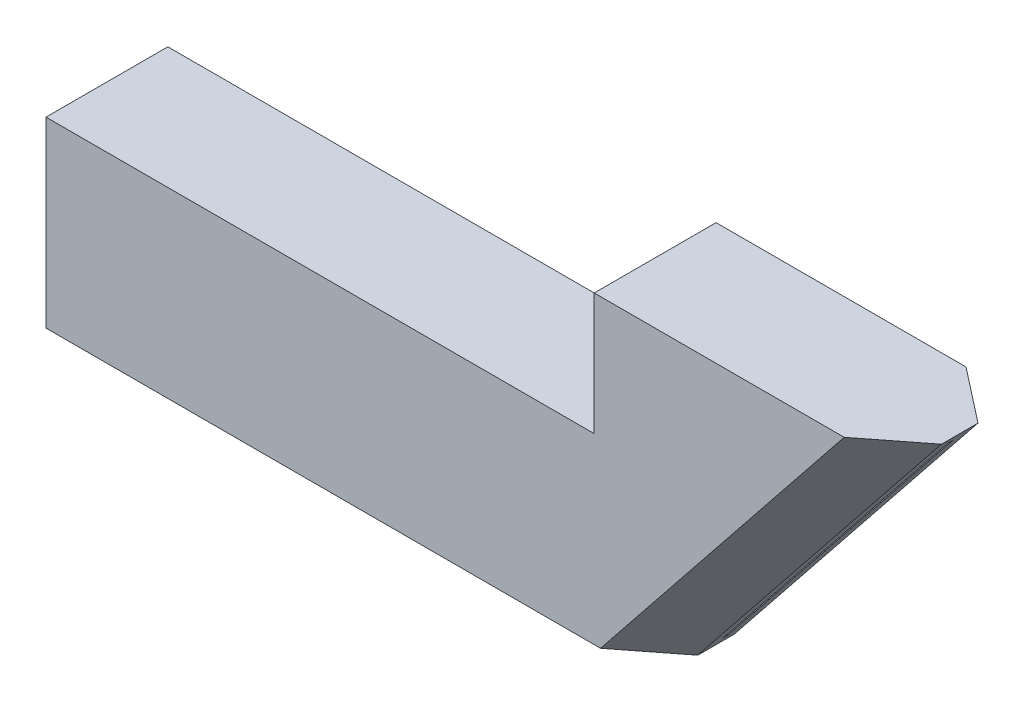
ISO-10303-21;
HEADER;
FILE_DESCRIPTION(('STEP AP214'),'2;1');
FILE_NAME('part.step','',(''),(''),'','','');
FILE_SCHEMA(('AUTOMOTIVE_DESIGN { 1 0 10303 214 1 1 1 1 }'));
ENDSEC;
DATA;
#1=APPLICATION_CONTEXT('core data for automotive mechanical design processes');
#2=APPLICATION_PROTOCOL_DEFINITION('international standard','automotive_design',2000,#1);
#3=PRODUCT_CONTEXT('',#1,'mechanical');
#4=PRODUCT('Part','Part','',(#3));
#5=PRODUCT_RELATED_PRODUCT_CATEGORY('part','',(#4));
#6=PRODUCT_DEFINITION_FORMATION('','',#4);
#7=PRODUCT_DEFINITION_CONTEXT('part definition',#1,'design');
#8=PRODUCT_DEFINITION('design','',#6,#7);
#9=PRODUCT_DEFINITION_SHAPE('','',#8);
#10=(LENGTH_UNIT() NAMED_UNIT(*) SI_UNIT(.MILLI.,.METRE.));
#11=(NAMED_UNIT(*) PLANE_ANGLE_UNIT() SI_UNIT($,.RADIAN.));
#12=(NAMED_UNIT(*) SI_UNIT($,.STERADIAN.) SOLID_ANGLE_UNIT());
#13=UNCERTAINTY_MEASURE_WITH_UNIT(LENGTH_MEASURE(1.E-05),#10,'distance_accuracy_value','');
#14=(GEOMETRIC_REPRESENTATION_CONTEXT(3) GLOBAL_UNCERTAINTY_ASSIGNED_CONTEXT((#13)) GLOBAL_UNIT_ASSIGNED_CONTEXT((#10,
#11,#12)) REPRESENTATION_CONTEXT('',''));
#15=CARTESIAN_POINT('',(0.,0.,0.));
#16=DIRECTION('',(0.,0.,1.));
#17=DIRECTION('',(1.,0.,0.));
#18=AXIS2_PLACEMENT_3D('',#15,#16,#17);
#19=CARTESIAN_POINT('',(0.,0.,50.8));
#20=DIRECTION('',(-1.,0.,0.));
#21=DIRECTION('',(0.,0.,1.));
#22=AXIS2_PLACEMENT_3D('',#19,#20,#21);
#23=PLANE('',#22);
#24=DIRECTION('',(0.,1.,0.));
#25=VECTOR('',#24,1.);
#26=CARTESIAN_POINT('',(0.,0.,0.));
#27=LINE('',#26,#25);
#28=CARTESIAN_POINT('',(0.,0.,0.));
#29=VERTEX_POINT('',#28);
#30=CARTESIAN_POINT('',(0.,76.2,0.));
#31=VERTEX_POINT('',#30);
#32=EDGE_CURVE('E157',#29,#31,#27,.T.);
#33=ORIENTED_EDGE('',*,*,#32,.F.);
#34=DIRECTION('',(0.,0.,-1.));
#35=VECTOR('',#34,1.);
#36=CARTESIAN_POINT('',(0.,0.,50.8));
#37=LINE('',#36,#35);
#38=CARTESIAN_POINT('',(0.,0.,50.8));
#39=VERTEX_POINT('',#38);
#40=EDGE_CURVE('E189',#39,#29,#37,.T.);
#41=ORIENTED_EDGE('',*,*,#40,.F.);
#42=DIRECTION('',(0.,1.,0.));
#43=VECTOR('',#42,1.);
#44=CARTESIAN_POINT('',(0.,0.,50.8));
#45=LINE('',#44,#43);
#46=CARTESIAN_POINT('',(0.,76.2,50.8));
#47=VERTEX_POINT('',#46);
#48=EDGE_CURVE('E161',#39,#47,#45,.T.);
#49=ORIENTED_EDGE('',*,*,#48,.T.);
#50=DIRECTION('',(0.,0.,-1.));
#51=VECTOR('',#50,1.);
#52=CARTESIAN_POINT('',(0.,76.2,50.8));
#53=LINE('',#52,#51);
#54=EDGE_CURVE('E176',#47,#31,#53,.T.);
#55=ORIENTED_EDGE('',*,*,#54,.T.);
#56=EDGE_LOOP('',(#33,#41,#49,#55));
#57=FACE_BOUND('',#56,.T.);
#58=ADVANCED_FACE('F33',(#57),#23,.T.);
#59=CARTESIAN_POINT('',(254.,0.,50.8));
#60=DIRECTION('',(0.,-1.,0.));
#61=DIRECTION('',(0.,0.,-1.));
#62=AXIS2_PLACEMENT_3D('',#59,#60,#61);
#63=PLANE('',#62);
#64=DIRECTION('',(-1.,0.,0.));
#65=VECTOR('',#64,1.);
#66=CARTESIAN_POINT('',(254.,0.,0.));
#67=LINE('',#66,#65);
#68=CARTESIAN_POINT('',(231.230490211689,0.,0.));
#69=VERTEX_POINT('',#68);
#70=EDGE_CURVE('E165',#69,#29,#67,.T.);
#71=ORIENTED_EDGE('',*,*,#70,.F.);
#72=DIRECTION('',(-0.788170109311511,0.,-0.615457454896665));
#73=VECTOR('',#72,1.);
#74=CARTESIAN_POINT('',(270.017512296972,0.,30.2875757575759));
#75=LINE('',#74,#73);
#76=CARTESIAN_POINT('',(254.,0.,17.7800000000002));
#77=VERTEX_POINT('',#76);
#78=EDGE_CURVE('E213',#69,#77,#75,.F.);
#79=ORIENTED_EDGE('',*,*,#78,.T.);
#80=DIRECTION('',(0.,0.,-1.));
#81=VECTOR('',#80,1.);
#82=CARTESIAN_POINT('',(254.,0.,50.8));
#83=LINE('',#82,#81);
#84=CARTESIAN_POINT('',(254.,0.,33.0199999999999));
#85=VERTEX_POINT('',#84);
#86=EDGE_CURVE('E193',#85,#77,#83,.T.);
#87=ORIENTED_EDGE('',*,*,#86,.F.);
#88=DIRECTION('',(-0.788170109311514,0.,0.615457454896662));
#89=VECTOR('',#88,1.);
#90=CARTESIAN_POINT('',(245.375185686246,0.,39.7548484848484));
#91=LINE('',#90,#89);
#92=CARTESIAN_POINT('',(231.230490211689,0.,50.8));
#93=VERTEX_POINT('',#92);
#94=EDGE_CURVE('E204',#85,#93,#91,.T.);
#95=ORIENTED_EDGE('',*,*,#94,.T.);
#96=DIRECTION('',(-1.,0.,0.));
#97=VECTOR('',#96,1.);
#98=CARTESIAN_POINT('',(254.,0.,50.8));
#99=LINE('',#98,#97);
#100=EDGE_CURVE('E174',#93,#39,#99,.T.);
#101=ORIENTED_EDGE('',*,*,#100,.T.);
#102=ORIENTED_EDGE('',*,*,#40,.T.);
#103=EDGE_LOOP('',(#71,#79,#87,#95,#101,#102));
#104=FACE_BOUND('',#103,.T.);
#105=ADVANCED_FACE('F217',(#104),#63,.T.);
#106=CARTESIAN_POINT('',(355.6,127.,50.8));
#107=DIRECTION('',(0.78086880944303,-0.624695047554424,0.));
#108=DIRECTION('',(0.624695047554424,0.78086880944303,0.));
#109=AXIS2_PLACEMENT_3D('',#106,#107,#108);
#110=PLANE('',#109);
#111=DIRECTION('',(-0.624695047554425,-0.78086880944303,0.));
#112=VECTOR('',#111,1.);
#113=CARTESIAN_POINT('',(257.966813551971,4.95851693996319,26.4160000000001));
#114=LINE('',#113,#112);
#115=CARTESIAN_POINT('',(351.63318644803,122.041483060037,26.4160000000001));
#116=VERTEX_POINT('',#115);
#117=CARTESIAN_POINT('',(257.966813551971,4.95851693996327,26.4160000000001));
#118=VERTEX_POINT('',#117);
#119=EDGE_CURVE('E48',#116,#118,#114,.T.);
#120=ORIENTED_EDGE('',*,*,#119,.F.);
#121=DIRECTION('',(0.,0.,1.));
#122=VECTOR('',#121,1.);
#123=CARTESIAN_POINT('',(351.63318644803,122.041483060037,26.4160000000001));
#124=LINE('',#123,#122);
#125=CARTESIAN_POINT('',(351.63318644803,122.041483060037,24.3840000000001));
#126=VERTEX_POINT('',#125);
#127=EDGE_CURVE('E142',#126,#116,#124,.T.);
#128=ORIENTED_EDGE('',*,*,#127,.F.);
#129=DIRECTION('',(0.624695047554425,0.78086880944303,0.));
#130=VECTOR('',#129,1.);
#131=CARTESIAN_POINT('',(257.966813551971,4.95851693996319,24.3840000000001));
#132=LINE('',#131,#130);
#133=CARTESIAN_POINT('',(257.966813551971,4.95851693996319,24.3840000000001));
#134=VERTEX_POINT('',#133);
#135=EDGE_CURVE('E145',#134,#126,#132,.T.);
#136=ORIENTED_EDGE('',*,*,#135,.F.);
#137=DIRECTION('',(0.,0.,-1.));
#138=VECTOR('',#137,1.);
#139=CARTESIAN_POINT('',(257.966813551971,4.95851693996319,26.4160000000001));
#140=LINE('',#139,#138);
#141=EDGE_CURVE('E151',#118,#134,#140,.T.);
#142=ORIENTED_EDGE('',*,*,#141,.F.);
#143=EDGE_LOOP('',(#120,#128,#136,#142));
#144=FACE_BOUND('',#143,.T.);
#145=ORIENTED_EDGE('',*,*,#86,.T.);
#146=DIRECTION('',(0.624695047554424,0.78086880944303,0.));
#147=VECTOR('',#146,1.);
#148=CARTESIAN_POINT('',(355.6,127.,17.7800000000002));
#149=LINE('',#148,#147);
#150=CARTESIAN_POINT('',(355.6,127.,17.7800000000002));
#151=VERTEX_POINT('',#150);
#152=EDGE_CURVE('E41',#77,#151,#149,.T.);
#153=ORIENTED_EDGE('',*,*,#152,.T.);
#154=DIRECTION('',(0.,0.,-1.));
#155=VECTOR('',#154,1.);
#156=CARTESIAN_POINT('',(355.6,127.,50.8));
#157=LINE('',#156,#155);
#158=CARTESIAN_POINT('',(355.6,127.,33.0199999999999));
#159=VERTEX_POINT('',#158);
#160=EDGE_CURVE('E195',#159,#151,#157,.T.);
#161=ORIENTED_EDGE('',*,*,#160,.F.);
#162=DIRECTION('',(-0.624695047554424,-0.78086880944303,0.));
#163=VECTOR('',#162,1.);
#164=CARTESIAN_POINT('',(254.,0.,33.0199999999999));
#165=LINE('',#164,#163);
#166=EDGE_CURVE('E192',#159,#85,#165,.T.);
#167=ORIENTED_EDGE('',*,*,#166,.T.);
#168=EDGE_LOOP('',(#145,#153,#161,#167));
#169=FACE_BOUND('',#168,.T.);
#170=ADVANCED_FACE('F220',(#144,#169),#110,.T.);
#171=CARTESIAN_POINT('',(228.6,127.,50.8));
#172=DIRECTION('',(0.,1.,0.));
#173=DIRECTION('',(0.,0.,1.));
#174=AXIS2_PLACEMENT_3D('',#171,#172,#173);
#175=PLANE('',#174);
#176=ORIENTED_EDGE('',*,*,#160,.T.);
#177=DIRECTION('',(0.788170109311511,0.,0.615457454896665));
#178=VECTOR('',#177,1.);
#179=CARTESIAN_POINT('',(292.723572903033,127.,-31.3182407692402));
#180=LINE('',#179,#178);
#181=CARTESIAN_POINT('',(332.830490211689,127.,0.));
#182=VERTEX_POINT('',#181);
#183=EDGE_CURVE('E11',#151,#182,#180,.F.);
#184=ORIENTED_EDGE('',*,*,#183,.T.);
#185=DIRECTION('',(1.,0.,0.));
#186=VECTOR('',#185,1.);
#187=CARTESIAN_POINT('',(228.6,127.,0.));
#188=LINE('',#187,#186);
#189=CARTESIAN_POINT('',(228.6,127.,0.));
#190=VERTEX_POINT('',#189);
#191=EDGE_CURVE('E185',#190,#182,#188,.T.);
#192=ORIENTED_EDGE('',*,*,#191,.F.);
#193=DIRECTION('',(0.,0.,-1.));
#194=VECTOR('',#193,1.);
#195=CARTESIAN_POINT('',(228.6,127.,50.8));
#196=LINE('',#195,#194);
#197=CARTESIAN_POINT('',(228.6,127.,50.8));
#198=VERTEX_POINT('',#197);
#199=EDGE_CURVE('E197',#198,#190,#196,.T.);
#200=ORIENTED_EDGE('',*,*,#199,.F.);
#201=DIRECTION('',(1.,0.,0.));
#202=VECTOR('',#201,1.);
#203=CARTESIAN_POINT('',(228.6,127.,50.8));
#204=LINE('',#203,#202);
#205=CARTESIAN_POINT('',(332.830490211689,127.,50.8));
#206=VERTEX_POINT('',#205);
#207=EDGE_CURVE('E171',#198,#206,#204,.T.);
#208=ORIENTED_EDGE('',*,*,#207,.T.);
#209=DIRECTION('',(0.788170109311514,0.,-0.615457454896662));
#210=VECTOR('',#209,1.);
#211=CARTESIAN_POINT('',(268.081246292306,127.,101.360665011664));
#212=LINE('',#211,#210);
#213=EDGE_CURVE('E208',#206,#159,#212,.T.);
#214=ORIENTED_EDGE('',*,*,#213,.T.);
#215=EDGE_LOOP('',(#176,#184,#192,#200,#208,#214));
#216=FACE_BOUND('',#215,.T.);
#217=ADVANCED_FACE('F225',(#216),#175,.T.);
#218=CARTESIAN_POINT('',(228.6,76.2,50.8));
#219=DIRECTION('',(-1.,0.,0.));
#220=DIRECTION('',(0.,0.,1.));
#221=AXIS2_PLACEMENT_3D('',#218,#219,#220);
#222=PLANE('',#221);
#223=DIRECTION('',(0.,1.,0.));
#224=VECTOR('',#223,1.);
#225=CARTESIAN_POINT('',(228.6,76.2,0.));
#226=LINE('',#225,#224);
#227=CARTESIAN_POINT('',(228.6,76.2,0.));
#228=VERTEX_POINT('',#227);
#229=EDGE_CURVE('E182',#228,#190,#226,.T.);
#230=ORIENTED_EDGE('',*,*,#229,.F.);
#231=DIRECTION('',(0.,0.,-1.));
#232=VECTOR('',#231,1.);
#233=CARTESIAN_POINT('',(228.6,76.2,50.8));
#234=LINE('',#233,#232);
#235=CARTESIAN_POINT('',(228.6,76.2,50.8));
#236=VERTEX_POINT('',#235);
#237=EDGE_CURVE('E199',#236,#228,#234,.T.);
#238=ORIENTED_EDGE('',*,*,#237,.F.);
#239=DIRECTION('',(0.,1.,0.));
#240=VECTOR('',#239,1.);
#241=CARTESIAN_POINT('',(228.6,76.2,50.8));
#242=LINE('',#241,#240);
#243=EDGE_CURVE('E168',#236,#198,#242,.T.);
#244=ORIENTED_EDGE('',*,*,#243,.T.);
#245=ORIENTED_EDGE('',*,*,#199,.T.);
#246=EDGE_LOOP('',(#230,#238,#244,#245));
#247=FACE_BOUND('',#246,.T.);
#248=ADVANCED_FACE('F231',(#247),#222,.T.);
#249=CARTESIAN_POINT('',(0.,76.2,50.8));
#250=DIRECTION('',(0.,1.,0.));
#251=DIRECTION('',(0.,0.,1.));
#252=AXIS2_PLACEMENT_3D('',#249,#250,#251);
#253=PLANE('',#252);
#254=DIRECTION('',(1.,0.,0.));
#255=VECTOR('',#254,1.);
#256=CARTESIAN_POINT('',(0.,76.2,0.));
#257=LINE('',#256,#255);
#258=EDGE_CURVE('E179',#31,#228,#257,.T.);
#259=ORIENTED_EDGE('',*,*,#258,.F.);
#260=ORIENTED_EDGE('',*,*,#54,.F.);
#261=DIRECTION('',(1.,0.,0.));
#262=VECTOR('',#261,1.);
#263=CARTESIAN_POINT('',(0.,76.2,50.8));
#264=LINE('',#263,#262);
#265=EDGE_CURVE('E164',#47,#236,#264,.T.);
#266=ORIENTED_EDGE('',*,*,#265,.T.);
#267=ORIENTED_EDGE('',*,*,#237,.T.);
#268=EDGE_LOOP('',(#259,#260,#266,#267));
#269=FACE_BOUND('',#268,.T.);
#270=ADVANCED_FACE('F247',(#269),#253,.T.);
#271=CARTESIAN_POINT('',(0.,0.,50.8));
#272=DIRECTION('',(0.,0.,-1.));
#273=DIRECTION('',(-1.,0.,0.));
#274=AXIS2_PLACEMENT_3D('',#271,#272,#273);
#275=PLANE('',#274);
#276=ORIENTED_EDGE('',*,*,#100,.F.);
#277=DIRECTION('',(0.624695047554424,0.78086880944303,0.));
#278=VECTOR('',#277,1.);
#279=CARTESIAN_POINT('',(341.716152568103,138.107077945518,50.8));
#280=LINE('',#279,#278);
#281=EDGE_CURVE('E206',#93,#206,#280,.T.);
#282=ORIENTED_EDGE('',*,*,#281,.T.);
#283=ORIENTED_EDGE('',*,*,#207,.F.);
#284=ORIENTED_EDGE('',*,*,#243,.F.);
#285=ORIENTED_EDGE('',*,*,#265,.F.);
#286=ORIENTED_EDGE('',*,*,#48,.F.);
#287=EDGE_LOOP('',(#276,#282,#283,#284,#285,#286));
#288=FACE_BOUND('',#287,.T.);
#289=ADVANCED_FACE('F237',(#288),#275,.F.);
#290=CARTESIAN_POINT('',(0.,0.,0.));
#291=DIRECTION('',(0.,0.,-1.));
#292=DIRECTION('',(-1.,0.,0.));
#293=AXIS2_PLACEMENT_3D('',#290,#291,#292);
#294=PLANE('',#293);
#295=ORIENTED_EDGE('',*,*,#191,.T.);
#296=DIRECTION('',(-0.624695047554424,-0.78086880944303,0.));
#297=VECTOR('',#296,1.);
#298=CARTESIAN_POINT('',(140.994201348591,-112.795361078873,0.));
#299=LINE('',#298,#297);
#300=EDGE_CURVE('E210',#182,#69,#299,.T.);
#301=ORIENTED_EDGE('',*,*,#300,.T.);
#302=ORIENTED_EDGE('',*,*,#70,.T.);
#303=ORIENTED_EDGE('',*,*,#32,.T.);
#304=ORIENTED_EDGE('',*,*,#258,.T.);
#305=ORIENTED_EDGE('',*,*,#229,.T.);
#306=EDGE_LOOP('',(#295,#301,#302,#303,#304,#305));
#307=FACE_BOUND('',#306,.T.);
#308=ADVANCED_FACE('F227',(#307),#294,.T.);
#309=CARTESIAN_POINT('',(355.6,127.,33.0199999999999));
#310=DIRECTION('',(0.552157630374231,-0.441726104299385,0.707106781186549));
#311=DIRECTION('',(0.624695047554424,0.78086880944303,0.));
#312=AXIS2_PLACEMENT_3D('',#309,#310,#311);
#313=PLANE('',#312);
#314=ORIENTED_EDGE('',*,*,#213,.F.);
#315=ORIENTED_EDGE('',*,*,#281,.F.);
#316=ORIENTED_EDGE('',*,*,#94,.F.);
#317=ORIENTED_EDGE('',*,*,#166,.F.);
#318=EDGE_LOOP('',(#314,#315,#316,#317));
#319=FACE_BOUND('',#318,.T.);
#320=ADVANCED_FACE('F242',(#319),#313,.T.);
#321=CARTESIAN_POINT('',(140.994201348591,-112.795361078873,0.));
#322=DIRECTION('',(-0.552157630374234,0.441726104299387,0.707106781186546));
#323=DIRECTION('',(-0.624695047554424,-0.78086880944303,0.));
#324=AXIS2_PLACEMENT_3D('',#321,#322,#323);
#325=PLANE('',#324);
#326=ORIENTED_EDGE('',*,*,#183,.F.);
#327=ORIENTED_EDGE('',*,*,#152,.F.);
#328=ORIENTED_EDGE('',*,*,#78,.F.);
#329=ORIENTED_EDGE('',*,*,#300,.F.);
#330=EDGE_LOOP('',(#326,#327,#328,#329));
#331=FACE_BOUND('',#330,.T.);
#332=ADVANCED_FACE('F35',(#331),#325,.F.);
#333=CARTESIAN_POINT('',(253.008296612007,8.92533049193378,26.4160000000001));
#334=DIRECTION('',(0.,0.,1.));
#335=DIRECTION('',(1.,0.,0.));
#336=AXIS2_PLACEMENT_3D('',#333,#334,#335);
#337=PLANE('',#336);
#338=ORIENTED_EDGE('',*,*,#119,.T.);
#339=DIRECTION('',(0.78086880944303,-0.624695047554424,0.));
#340=VECTOR('',#339,1.);
#341=CARTESIAN_POINT('',(253.008296612007,8.92533049193378,26.4160000000001));
#342=LINE('',#341,#340);
#343=CARTESIAN_POINT('',(253.008296612007,8.92533049193378,26.4160000000001));
#344=VERTEX_POINT('',#343);
#345=EDGE_CURVE('E120',#344,#118,#342,.T.);
#346=ORIENTED_EDGE('',*,*,#345,.F.);
#347=DIRECTION('',(-0.624695047554425,-0.78086880944303,0.));
#348=VECTOR('',#347,1.);
#349=CARTESIAN_POINT('',(253.008296612007,8.92533049193378,26.4160000000001));
#350=LINE('',#349,#348);
#351=CARTESIAN_POINT('',(346.674669508066,126.008296612007,26.4160000000001));
#352=VERTEX_POINT('',#351);
#353=EDGE_CURVE('E124',#352,#344,#350,.T.);
#354=ORIENTED_EDGE('',*,*,#353,.F.);
#355=DIRECTION('',(0.78086880944303,-0.624695047554424,0.));
#356=VECTOR('',#355,1.);
#357=CARTESIAN_POINT('',(346.674669508066,126.008296612007,26.4160000000001));
#358=LINE('',#357,#356);
#359=EDGE_CURVE('E155',#352,#116,#358,.T.);
#360=ORIENTED_EDGE('',*,*,#359,.T.);
#361=EDGE_LOOP('',(#338,#346,#354,#360));
#362=FACE_BOUND('',#361,.T.);
#363=ADVANCED_FACE('F122',(#362),#337,.F.);
#364=CARTESIAN_POINT('',(346.674669508066,126.008296612007,26.4160000000001));
#365=DIRECTION('',(0.624695047554424,0.78086880944303,0.));
#366=DIRECTION('',(-0.78086880944303,0.624695047554425,0.));
#367=AXIS2_PLACEMENT_3D('',#364,#365,#366);
#368=PLANE('',#367);
#369=ORIENTED_EDGE('',*,*,#127,.T.);
#370=ORIENTED_EDGE('',*,*,#359,.F.);
#371=DIRECTION('',(0.,0.,1.));
#372=VECTOR('',#371,1.);
#373=CARTESIAN_POINT('',(346.674669508066,126.008296612007,26.4160000000001));
#374=LINE('',#373,#372);
#375=CARTESIAN_POINT('',(346.674669508066,126.008296612007,24.3840000000001));
#376=VERTEX_POINT('',#375);
#377=EDGE_CURVE('E130',#376,#352,#374,.T.);
#378=ORIENTED_EDGE('',*,*,#377,.F.);
#379=DIRECTION('',(0.78086880944303,-0.624695047554424,0.));
#380=VECTOR('',#379,1.);
#381=CARTESIAN_POINT('',(346.674669508066,126.008296612007,24.3840000000001));
#382=LINE('',#381,#380);
#383=EDGE_CURVE('E158',#376,#126,#382,.T.);
#384=ORIENTED_EDGE('',*,*,#383,.T.);
#385=EDGE_LOOP('',(#369,#370,#378,#384));
#386=FACE_BOUND('',#385,.T.);
#387=ADVANCED_FACE('F327',(#386),#368,.F.);
#388=CARTESIAN_POINT('',(253.008296612007,8.92533049193378,24.3840000000001));
#389=DIRECTION('',(0.,0.,-1.));
#390=DIRECTION('',(-1.,0.,0.));
#391=AXIS2_PLACEMENT_3D('',#388,#389,#390);
#392=PLANE('',#391);
#393=ORIENTED_EDGE('',*,*,#135,.T.);
#394=ORIENTED_EDGE('',*,*,#383,.F.);
#395=DIRECTION('',(0.624695047554425,0.78086880944303,0.));
#396=VECTOR('',#395,1.);
#397=CARTESIAN_POINT('',(253.008296612007,8.92533049193378,24.3840000000001));
#398=LINE('',#397,#396);
#399=CARTESIAN_POINT('',(253.008296612007,8.92533049193378,24.3840000000001));
#400=VERTEX_POINT('',#399);
#401=EDGE_CURVE('E138',#400,#376,#398,.T.);
#402=ORIENTED_EDGE('',*,*,#401,.F.);
#403=DIRECTION('',(0.78086880944303,-0.624695047554424,0.));
#404=VECTOR('',#403,1.);
#405=CARTESIAN_POINT('',(253.008296612007,8.92533049193378,24.3840000000001));
#406=LINE('',#405,#404);
#407=EDGE_CURVE('E129',#400,#134,#406,.T.);
#408=ORIENTED_EDGE('',*,*,#407,.T.);
#409=EDGE_LOOP('',(#393,#394,#402,#408));
#410=FACE_BOUND('',#409,.T.);
#411=ADVANCED_FACE('F335',(#410),#392,.F.);
#412=CARTESIAN_POINT('',(253.008296612007,8.92533049193378,26.4160000000001));
#413=DIRECTION('',(-0.624695047554424,-0.78086880944303,0.));
#414=DIRECTION('',(0.78086880944303,-0.624695047554425,0.));
#415=AXIS2_PLACEMENT_3D('',#412,#413,#414);
#416=PLANE('',#415);
#417=ORIENTED_EDGE('',*,*,#141,.T.);
#418=ORIENTED_EDGE('',*,*,#407,.F.);
#419=DIRECTION('',(0.,0.,-1.));
#420=VECTOR('',#419,1.);
#421=CARTESIAN_POINT('',(253.008296612007,8.92533049193378,26.4160000000001));
#422=LINE('',#421,#420);
#423=EDGE_CURVE('E133',#344,#400,#422,.T.);
#424=ORIENTED_EDGE('',*,*,#423,.F.);
#425=ORIENTED_EDGE('',*,*,#345,.T.);
#426=EDGE_LOOP('',(#417,#418,#424,#425));
#427=FACE_BOUND('',#426,.T.);
#428=ADVANCED_FACE('F134',(#427),#416,.F.);
#429=CARTESIAN_POINT('',(149.919531840525,-119.93562547242,0.));
#430=DIRECTION('',(-0.78086880944303,0.624695047554425,0.));
#431=DIRECTION('',(-0.624695047554425,-0.78086880944303,0.));
#432=AXIS2_PLACEMENT_3D('',#429,#430,#431);
#433=PLANE('',#432);
#434=ORIENTED_EDGE('',*,*,#353,.T.);
#435=ORIENTED_EDGE('',*,*,#423,.T.);
#436=ORIENTED_EDGE('',*,*,#401,.T.);
#437=ORIENTED_EDGE('',*,*,#377,.T.);
#438=EDGE_LOOP('',(#434,#435,#436,#437));
#439=FACE_BOUND('',#438,.T.);
#440=ADVANCED_FACE('F140',(#439),#433,.F.);
#441=CLOSED_SHELL('',(#58,#105,#170,#217,#248,#270,#289,#308,#320,#332,#363,#387,#411,#428,#440));
#442=MANIFOLD_SOLID_BREP('B2',#441);
#443=ADVANCED_BREP_SHAPE_REPRESENTATION('',(#18,#442),#14);
#444=SHAPE_DEFINITION_REPRESENTATION(#9,#443);
ENDSEC;
END-ISO-10303-21;
